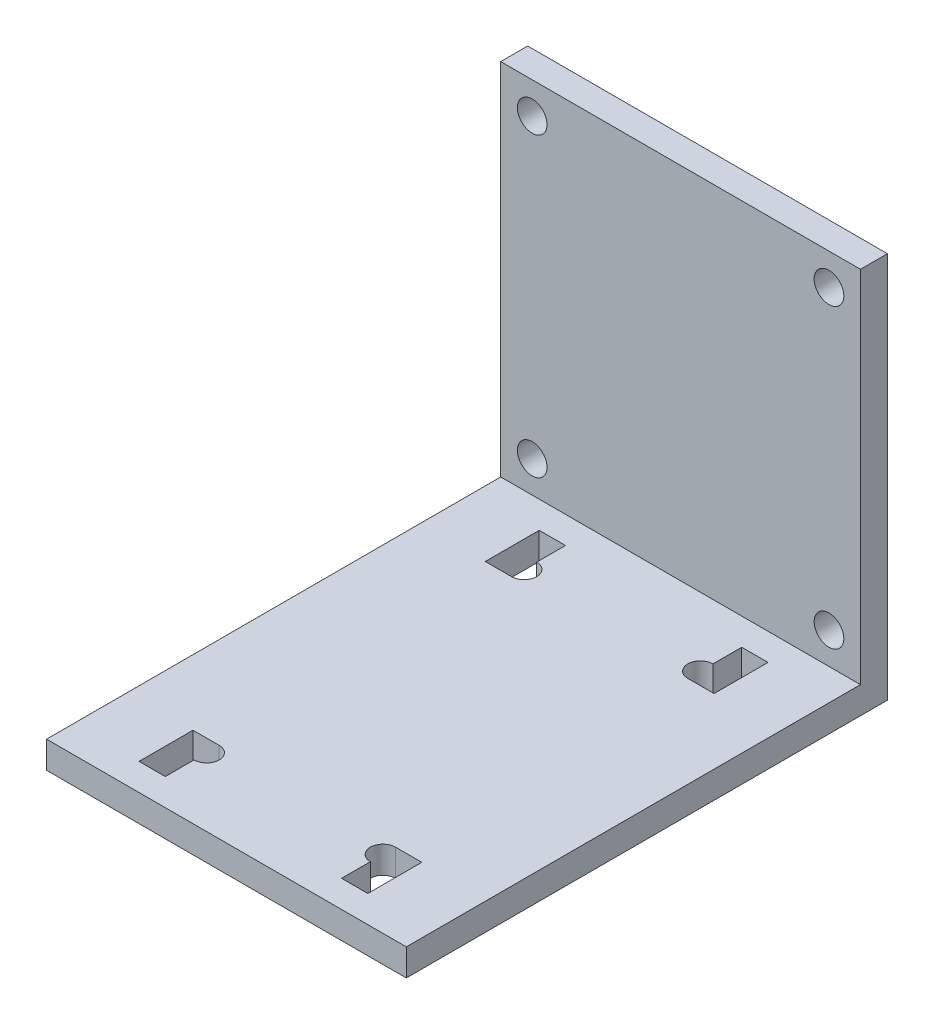
ISO-10303-21;
HEADER;
FILE_DESCRIPTION(('STEP AP214'),'2;1');
FILE_NAME('part.step','',(''),(''),'','','');
FILE_SCHEMA(('AUTOMOTIVE_DESIGN { 1 0 10303 214 1 1 1 1 }'));
ENDSEC;
DATA;
#1=APPLICATION_CONTEXT('core data for automotive mechanical design processes');
#2=APPLICATION_PROTOCOL_DEFINITION('international standard','automotive_design',2000,#1);
#3=PRODUCT_CONTEXT('',#1,'mechanical');
#4=PRODUCT('Part','Part','',(#3));
#5=PRODUCT_RELATED_PRODUCT_CATEGORY('part','',(#4));
#6=PRODUCT_DEFINITION_FORMATION('','',#4);
#7=PRODUCT_DEFINITION_CONTEXT('part definition',#1,'design');
#8=PRODUCT_DEFINITION('design','',#6,#7);
#9=PRODUCT_DEFINITION_SHAPE('','',#8);
#10=(LENGTH_UNIT() NAMED_UNIT(*) SI_UNIT(.MILLI.,.METRE.));
#11=(NAMED_UNIT(*) PLANE_ANGLE_UNIT() SI_UNIT($,.RADIAN.));
#12=(NAMED_UNIT(*) SI_UNIT($,.STERADIAN.) SOLID_ANGLE_UNIT());
#13=UNCERTAINTY_MEASURE_WITH_UNIT(LENGTH_MEASURE(1.E-05),#10,'distance_accuracy_value','');
#14=(GEOMETRIC_REPRESENTATION_CONTEXT(3) GLOBAL_UNCERTAINTY_ASSIGNED_CONTEXT((#13)) GLOBAL_UNIT_ASSIGNED_CONTEXT((#10,
#11,#12)) REPRESENTATION_CONTEXT('',''));
#15=CARTESIAN_POINT('',(0.,0.,0.));
#16=DIRECTION('',(0.,0.,1.));
#17=DIRECTION('',(1.,0.,0.));
#18=AXIS2_PLACEMENT_3D('',#15,#16,#17);
#19=CARTESIAN_POINT('',(0.,0.,3.));
#20=DIRECTION('',(0.,0.,-1.));
#21=DIRECTION('',(-1.,0.,0.));
#22=AXIS2_PLACEMENT_3D('',#19,#20,#21);
#23=PLANE('',#22);
#24=CARTESIAN_POINT('',(3.5,36.5,3.));
#25=DIRECTION('',(0.,0.,1.));
#26=DIRECTION('',(1.,0.,0.));
#27=AXIS2_PLACEMENT_3D('',#24,#25,#26);
#28=CIRCLE('',#27,1.65);
#29=CARTESIAN_POINT('',(5.15,36.5,3.));
#30=VERTEX_POINT('',#29);
#31=EDGE_CURVE('E106',#30,#30,#28,.T.);
#32=ORIENTED_EDGE('',*,*,#31,.F.);
#33=EDGE_LOOP('',(#32));
#34=FACE_BOUND('',#33,.T.);
#35=CARTESIAN_POINT('',(36.4999999999998,36.5,3.));
#36=DIRECTION('',(0.,0.,1.));
#37=DIRECTION('',(-1.,0.,0.));
#38=AXIS2_PLACEMENT_3D('',#35,#36,#37);
#39=CIRCLE('',#38,1.65);
#40=CARTESIAN_POINT('',(34.8499999999998,36.5,3.));
#41=VERTEX_POINT('',#40);
#42=EDGE_CURVE('E137',#41,#41,#39,.T.);
#43=ORIENTED_EDGE('',*,*,#42,.F.);
#44=EDGE_LOOP('',(#43));
#45=FACE_BOUND('',#44,.T.);
#46=CARTESIAN_POINT('',(36.4999999999998,3.5,3.));
#47=DIRECTION('',(0.,0.,1.));
#48=DIRECTION('',(1.,0.,0.));
#49=AXIS2_PLACEMENT_3D('',#46,#47,#48);
#50=CIRCLE('',#49,1.65);
#51=CARTESIAN_POINT('',(38.1499999999998,3.5,3.));
#52=VERTEX_POINT('',#51);
#53=EDGE_CURVE('E129',#52,#52,#50,.T.);
#54=ORIENTED_EDGE('',*,*,#53,.F.);
#55=EDGE_LOOP('',(#54));
#56=FACE_BOUND('',#55,.T.);
#57=CARTESIAN_POINT('',(3.5,3.5,3.));
#58=DIRECTION('',(0.,0.,1.));
#59=DIRECTION('',(-1.,0.,0.));
#60=AXIS2_PLACEMENT_3D('',#57,#58,#59);
#61=CIRCLE('',#60,1.65);
#62=CARTESIAN_POINT('',(1.85,3.5,3.));
#63=VERTEX_POINT('',#62);
#64=EDGE_CURVE('E120',#63,#63,#61,.T.);
#65=ORIENTED_EDGE('',*,*,#64,.F.);
#66=EDGE_LOOP('',(#65));
#67=FACE_BOUND('',#66,.T.);
#68=DIRECTION('',(-1.,0.,0.));
#69=VECTOR('',#68,1.);
#70=CARTESIAN_POINT('',(0.,0.,3.));
#71=LINE('',#70,#69);
#72=CARTESIAN_POINT('',(40.,0.,3.));
#73=VERTEX_POINT('',#72);
#74=CARTESIAN_POINT('',(0.,0.,3.));
#75=VERTEX_POINT('',#74);
#76=EDGE_CURVE('E57',#73,#75,#71,.T.);
#77=ORIENTED_EDGE('',*,*,#76,.F.);
#78=DIRECTION('',(0.,1.,0.));
#79=VECTOR('',#78,1.);
#80=CARTESIAN_POINT('',(40.,0.,3.));
#81=LINE('',#80,#79);
#82=CARTESIAN_POINT('',(40.,40.,3.));
#83=VERTEX_POINT('',#82);
#84=EDGE_CURVE('E111',#73,#83,#81,.T.);
#85=ORIENTED_EDGE('',*,*,#84,.T.);
#86=DIRECTION('',(-1.,0.,0.));
#87=VECTOR('',#86,1.);
#88=CARTESIAN_POINT('',(0.,40.,3.));
#89=LINE('',#88,#87);
#90=CARTESIAN_POINT('',(0.,40.,3.));
#91=VERTEX_POINT('',#90);
#92=EDGE_CURVE('E63',#83,#91,#89,.T.);
#93=ORIENTED_EDGE('',*,*,#92,.T.);
#94=DIRECTION('',(0.,-1.,0.));
#95=VECTOR('',#94,1.);
#96=CARTESIAN_POINT('',(0.,0.,3.));
#97=LINE('',#96,#95);
#98=EDGE_CURVE('E84',#91,#75,#97,.T.);
#99=ORIENTED_EDGE('',*,*,#98,.T.);
#100=EDGE_LOOP('',(#77,#85,#93,#99));
#101=FACE_BOUND('',#100,.T.);
#102=ADVANCED_FACE('F41',(#34,#45,#56,#67,#101),#23,.F.);
#103=CARTESIAN_POINT('',(0.,0.,3.));
#104=DIRECTION('',(1.,0.,0.));
#105=DIRECTION('',(0.,0.,-1.));
#106=AXIS2_PLACEMENT_3D('',#103,#104,#105);
#107=PLANE('',#106);
#108=DIRECTION('',(0.,-1.,0.));
#109=VECTOR('',#108,1.);
#110=CARTESIAN_POINT('',(0.,0.,0.));
#111=LINE('',#110,#109);
#112=CARTESIAN_POINT('',(0.,40.,0.));
#113=VERTEX_POINT('',#112);
#114=CARTESIAN_POINT('',(0.,-3.,0.));
#115=VERTEX_POINT('',#114);
#116=EDGE_CURVE('E91',#113,#115,#111,.T.);
#117=ORIENTED_EDGE('',*,*,#116,.T.);
#118=DIRECTION('',(0.,0.,1.));
#119=VECTOR('',#118,1.);
#120=CARTESIAN_POINT('',(0.,-3.,0.));
#121=LINE('',#120,#119);
#122=CARTESIAN_POINT('',(0.,-3.,53.5));
#123=VERTEX_POINT('',#122);
#124=EDGE_CURVE('E144',#115,#123,#121,.T.);
#125=ORIENTED_EDGE('',*,*,#124,.T.);
#126=DIRECTION('',(0.,-1.,0.));
#127=VECTOR('',#126,1.);
#128=CARTESIAN_POINT('',(0.,0.,53.5));
#129=LINE('',#128,#127);
#130=CARTESIAN_POINT('',(0.,0.,53.5));
#131=VERTEX_POINT('',#130);
#132=EDGE_CURVE('E198',#131,#123,#129,.T.);
#133=ORIENTED_EDGE('',*,*,#132,.F.);
#134=DIRECTION('',(0.,0.,1.));
#135=VECTOR('',#134,1.);
#136=CARTESIAN_POINT('',(0.,0.,0.));
#137=LINE('',#136,#135);
#138=EDGE_CURVE('E365',#75,#131,#137,.T.);
#139=ORIENTED_EDGE('',*,*,#138,.F.);
#140=ORIENTED_EDGE('',*,*,#98,.F.);
#141=DIRECTION('',(0.,0.,-1.));
#142=VECTOR('',#141,1.);
#143=CARTESIAN_POINT('',(0.,40.,3.));
#144=LINE('',#143,#142);
#145=EDGE_CURVE('E50',#91,#113,#144,.T.);
#146=ORIENTED_EDGE('',*,*,#145,.T.);
#147=EDGE_LOOP('',(#117,#125,#133,#139,#140,#146));
#148=FACE_BOUND('',#147,.T.);
#149=ADVANCED_FACE('F43',(#148),#107,.F.);
#150=CARTESIAN_POINT('',(40.,0.,3.));
#151=DIRECTION('',(-1.,0.,0.));
#152=DIRECTION('',(0.,0.,1.));
#153=AXIS2_PLACEMENT_3D('',#150,#151,#152);
#154=PLANE('',#153);
#155=DIRECTION('',(0.,1.,0.));
#156=VECTOR('',#155,1.);
#157=CARTESIAN_POINT('',(40.,0.,0.));
#158=LINE('',#157,#156);
#159=CARTESIAN_POINT('',(40.,-3.,0.));
#160=VERTEX_POINT('',#159);
#161=CARTESIAN_POINT('',(40.,40.,0.));
#162=VERTEX_POINT('',#161);
#163=EDGE_CURVE('E85',#160,#162,#158,.T.);
#164=ORIENTED_EDGE('',*,*,#163,.T.);
#165=DIRECTION('',(0.,0.,-1.));
#166=VECTOR('',#165,1.);
#167=CARTESIAN_POINT('',(40.,40.,3.));
#168=LINE('',#167,#166);
#169=EDGE_CURVE('E11',#83,#162,#168,.T.);
#170=ORIENTED_EDGE('',*,*,#169,.F.);
#171=ORIENTED_EDGE('',*,*,#84,.F.);
#172=DIRECTION('',(0.,0.,1.));
#173=VECTOR('',#172,1.);
#174=CARTESIAN_POINT('',(40.,0.,0.));
#175=LINE('',#174,#173);
#176=CARTESIAN_POINT('',(40.,0.,53.5));
#177=VERTEX_POINT('',#176);
#178=EDGE_CURVE('E373',#73,#177,#175,.T.);
#179=ORIENTED_EDGE('',*,*,#178,.T.);
#180=DIRECTION('',(0.,-1.,0.));
#181=VECTOR('',#180,1.);
#182=CARTESIAN_POINT('',(40.,0.,53.5));
#183=LINE('',#182,#181);
#184=CARTESIAN_POINT('',(40.,-3.,53.5));
#185=VERTEX_POINT('',#184);
#186=EDGE_CURVE('E194',#177,#185,#183,.T.);
#187=ORIENTED_EDGE('',*,*,#186,.T.);
#188=DIRECTION('',(0.,0.,1.));
#189=VECTOR('',#188,1.);
#190=CARTESIAN_POINT('',(40.,-3.,0.));
#191=LINE('',#190,#189);
#192=EDGE_CURVE('E125',#160,#185,#191,.T.);
#193=ORIENTED_EDGE('',*,*,#192,.F.);
#194=EDGE_LOOP('',(#164,#170,#171,#179,#187,#193));
#195=FACE_BOUND('',#194,.T.);
#196=ADVANCED_FACE('F544',(#195),#154,.F.);
#197=CARTESIAN_POINT('',(0.,40.,3.));
#198=DIRECTION('',(0.,-1.,0.));
#199=DIRECTION('',(0.,0.,-1.));
#200=AXIS2_PLACEMENT_3D('',#197,#198,#199);
#201=PLANE('',#200);
#202=DIRECTION('',(-1.,0.,0.));
#203=VECTOR('',#202,1.);
#204=CARTESIAN_POINT('',(0.,40.,0.));
#205=LINE('',#204,#203);
#206=EDGE_CURVE('E75',#162,#113,#205,.T.);
#207=ORIENTED_EDGE('',*,*,#206,.T.);
#208=ORIENTED_EDGE('',*,*,#145,.F.);
#209=ORIENTED_EDGE('',*,*,#92,.F.);
#210=ORIENTED_EDGE('',*,*,#169,.T.);
#211=EDGE_LOOP('',(#207,#208,#209,#210));
#212=FACE_BOUND('',#211,.T.);
#213=ADVANCED_FACE('F77',(#212),#201,.F.);
#214=CARTESIAN_POINT('',(0.,0.,0.));
#215=DIRECTION('',(0.,0.,-1.));
#216=DIRECTION('',(-1.,0.,0.));
#217=AXIS2_PLACEMENT_3D('',#214,#215,#216);
#218=PLANE('',#217);
#219=CARTESIAN_POINT('',(3.5,3.5,0.));
#220=DIRECTION('',(0.,0.,1.));
#221=DIRECTION('',(-1.,0.,0.));
#222=AXIS2_PLACEMENT_3D('',#219,#220,#221);
#223=CIRCLE('',#222,1.65);
#224=CARTESIAN_POINT('',(1.85,3.5,0.));
#225=VERTEX_POINT('',#224);
#226=EDGE_CURVE('E124',#225,#225,#223,.T.);
#227=ORIENTED_EDGE('',*,*,#226,.T.);
#228=EDGE_LOOP('',(#227));
#229=FACE_BOUND('',#228,.T.);
#230=CARTESIAN_POINT('',(36.4999999999998,3.5,0.));
#231=DIRECTION('',(0.,0.,1.));
#232=DIRECTION('',(1.,0.,0.));
#233=AXIS2_PLACEMENT_3D('',#230,#231,#232);
#234=CIRCLE('',#233,1.65);
#235=CARTESIAN_POINT('',(38.1499999999998,3.5,0.));
#236=VERTEX_POINT('',#235);
#237=EDGE_CURVE('E133',#236,#236,#234,.T.);
#238=ORIENTED_EDGE('',*,*,#237,.T.);
#239=EDGE_LOOP('',(#238));
#240=FACE_BOUND('',#239,.T.);
#241=CARTESIAN_POINT('',(36.4999999999998,36.5,0.));
#242=DIRECTION('',(0.,0.,1.));
#243=DIRECTION('',(-1.,0.,0.));
#244=AXIS2_PLACEMENT_3D('',#241,#242,#243);
#245=CIRCLE('',#244,1.65);
#246=CARTESIAN_POINT('',(34.8499999999998,36.5,0.));
#247=VERTEX_POINT('',#246);
#248=EDGE_CURVE('E118',#247,#247,#245,.T.);
#249=ORIENTED_EDGE('',*,*,#248,.T.);
#250=EDGE_LOOP('',(#249));
#251=FACE_BOUND('',#250,.T.);
#252=CARTESIAN_POINT('',(3.5,36.5,0.));
#253=DIRECTION('',(0.,0.,1.));
#254=DIRECTION('',(1.,0.,0.));
#255=AXIS2_PLACEMENT_3D('',#252,#253,#254);
#256=CIRCLE('',#255,1.65);
#257=CARTESIAN_POINT('',(5.15,36.5,0.));
#258=VERTEX_POINT('',#257);
#259=EDGE_CURVE('E100',#258,#258,#256,.T.);
#260=ORIENTED_EDGE('',*,*,#259,.T.);
#261=EDGE_LOOP('',(#260));
#262=FACE_BOUND('',#261,.T.);
#263=ORIENTED_EDGE('',*,*,#116,.F.);
#264=ORIENTED_EDGE('',*,*,#206,.F.);
#265=ORIENTED_EDGE('',*,*,#163,.F.);
#266=DIRECTION('',(1.,0.,0.));
#267=VECTOR('',#266,1.);
#268=CARTESIAN_POINT('',(0.,-3.,0.));
#269=LINE('',#268,#267);
#270=EDGE_CURVE('E98',#115,#160,#269,.T.);
#271=ORIENTED_EDGE('',*,*,#270,.F.);
#272=EDGE_LOOP('',(#263,#264,#265,#271));
#273=FACE_BOUND('',#272,.T.);
#274=ADVANCED_FACE('F96',(#229,#240,#251,#262,#273),#218,.T.);
#275=CARTESIAN_POINT('',(3.5,36.5,0.));
#276=DIRECTION('',(0.,0.,1.));
#277=DIRECTION('',(1.,0.,0.));
#278=AXIS2_PLACEMENT_3D('',#275,#276,#277);
#279=CYLINDRICAL_SURFACE('',#278,1.65);
#280=ORIENTED_EDGE('',*,*,#259,.F.);
#281=EDGE_LOOP('',(#280));
#282=FACE_BOUND('',#281,.T.);
#283=ORIENTED_EDGE('',*,*,#31,.T.);
#284=EDGE_LOOP('',(#283));
#285=FACE_BOUND('',#284,.T.);
#286=ADVANCED_FACE('F567',(#282,#285),#279,.F.);
#287=CARTESIAN_POINT('',(36.4999999999998,36.5,0.));
#288=DIRECTION('',(0.,0.,1.));
#289=DIRECTION('',(1.,0.,0.));
#290=AXIS2_PLACEMENT_3D('',#287,#288,#289);
#291=CYLINDRICAL_SURFACE('',#290,1.65);
#292=ORIENTED_EDGE('',*,*,#248,.F.);
#293=EDGE_LOOP('',(#292));
#294=FACE_BOUND('',#293,.T.);
#295=ORIENTED_EDGE('',*,*,#42,.T.);
#296=EDGE_LOOP('',(#295));
#297=FACE_BOUND('',#296,.T.);
#298=ADVANCED_FACE('F594',(#294,#297),#291,.F.);
#299=CARTESIAN_POINT('',(36.4999999999998,3.5,0.));
#300=DIRECTION('',(0.,0.,1.));
#301=DIRECTION('',(1.,0.,0.));
#302=AXIS2_PLACEMENT_3D('',#299,#300,#301);
#303=CYLINDRICAL_SURFACE('',#302,1.65);
#304=ORIENTED_EDGE('',*,*,#237,.F.);
#305=EDGE_LOOP('',(#304));
#306=FACE_BOUND('',#305,.T.);
#307=ORIENTED_EDGE('',*,*,#53,.T.);
#308=EDGE_LOOP('',(#307));
#309=FACE_BOUND('',#308,.T.);
#310=ADVANCED_FACE('F601',(#306,#309),#303,.F.);
#311=CARTESIAN_POINT('',(3.5,3.5,0.));
#312=DIRECTION('',(0.,0.,1.));
#313=DIRECTION('',(1.,0.,0.));
#314=AXIS2_PLACEMENT_3D('',#311,#312,#313);
#315=CYLINDRICAL_SURFACE('',#314,1.65);
#316=ORIENTED_EDGE('',*,*,#226,.F.);
#317=EDGE_LOOP('',(#316));
#318=FACE_BOUND('',#317,.T.);
#319=ORIENTED_EDGE('',*,*,#64,.T.);
#320=EDGE_LOOP('',(#319));
#321=FACE_BOUND('',#320,.T.);
#322=ADVANCED_FACE('F609',(#318,#321),#315,.F.);
#323=CARTESIAN_POINT('',(0.,-3.,0.));
#324=DIRECTION('',(0.,-1.,0.));
#325=DIRECTION('',(0.,0.,-1.));
#326=AXIS2_PLACEMENT_3D('',#323,#324,#325);
#327=PLANE('',#326);
#328=ORIENTED_EDGE('',*,*,#192,.T.);
#329=DIRECTION('',(1.,0.,0.));
#330=VECTOR('',#329,1.);
#331=CARTESIAN_POINT('',(0.,-3.,53.5));
#332=LINE('',#331,#330);
#333=EDGE_CURVE('E282',#123,#185,#332,.T.);
#334=ORIENTED_EDGE('',*,*,#333,.F.);
#335=ORIENTED_EDGE('',*,*,#124,.F.);
#336=ORIENTED_EDGE('',*,*,#270,.T.);
#337=EDGE_LOOP('',(#328,#334,#335,#336));
#338=FACE_BOUND('',#337,.T.);
#339=CARTESIAN_POINT('',(29.8,-3.,10.6));
#340=DIRECTION('',(0.,-1.,0.));
#341=DIRECTION('',(0.,0.,-1.));
#342=AXIS2_PLACEMENT_3D('',#339,#340,#341);
#343=CIRCLE('',#342,1.4);
#344=CARTESIAN_POINT('',(29.8,-3.,12.));
#345=VERTEX_POINT('',#344);
#346=CARTESIAN_POINT('',(29.8,-3.,9.2));
#347=VERTEX_POINT('',#346);
#348=EDGE_CURVE('E322',#345,#347,#343,.T.);
#349=ORIENTED_EDGE('',*,*,#348,.F.);
#350=DIRECTION('',(-1.,0.,0.));
#351=VECTOR('',#350,1.);
#352=CARTESIAN_POINT('',(0.,-3.,12.));
#353=LINE('',#352,#351);
#354=CARTESIAN_POINT('',(32.72,-3.,12.));
#355=VERTEX_POINT('',#354);
#356=EDGE_CURVE('E318',#355,#345,#353,.T.);
#357=ORIENTED_EDGE('',*,*,#356,.F.);
#358=DIRECTION('',(0.,0.,1.));
#359=VECTOR('',#358,1.);
#360=CARTESIAN_POINT('',(32.72,-3.,0.));
#361=LINE('',#360,#359);
#362=CARTESIAN_POINT('',(32.72,-3.,6.));
#363=VERTEX_POINT('',#362);
#364=EDGE_CURVE('E314',#363,#355,#361,.T.);
#365=ORIENTED_EDGE('',*,*,#364,.F.);
#366=DIRECTION('',(-1.,0.,0.));
#367=VECTOR('',#366,1.);
#368=CARTESIAN_POINT('',(0.,-3.,5.99999999999999));
#369=LINE('',#368,#367);
#370=CARTESIAN_POINT('',(29.8,-3.,6.));
#371=VERTEX_POINT('',#370);
#372=EDGE_CURVE('E310',#363,#371,#369,.T.);
#373=ORIENTED_EDGE('',*,*,#372,.T.);
#374=DIRECTION('',(0.,0.,1.));
#375=VECTOR('',#374,1.);
#376=CARTESIAN_POINT('',(29.8,-3.,-1.6154612370034E-13));
#377=LINE('',#376,#375);
#378=EDGE_CURVE('E306',#371,#347,#377,.T.);
#379=ORIENTED_EDGE('',*,*,#378,.T.);
#380=EDGE_LOOP('',(#349,#357,#365,#373,#379));
#381=FACE_BOUND('',#380,.T.);
#382=CARTESIAN_POINT('',(10.2,-3.,45.9));
#383=DIRECTION('',(0.,-1.,0.));
#384=DIRECTION('',(0.,0.,-1.));
#385=AXIS2_PLACEMENT_3D('',#382,#383,#384);
#386=CIRCLE('',#385,1.4);
#387=CARTESIAN_POINT('',(10.2,-3.,44.5));
#388=VERTEX_POINT('',#387);
#389=CARTESIAN_POINT('',(10.2,-3.,47.3));
#390=VERTEX_POINT('',#389);
#391=EDGE_CURVE('E302',#388,#390,#386,.T.);
#392=ORIENTED_EDGE('',*,*,#391,.F.);
#393=DIRECTION('',(1.,0.,0.));
#394=VECTOR('',#393,1.);
#395=CARTESIAN_POINT('',(0.,-3.,44.5));
#396=LINE('',#395,#394);
#397=CARTESIAN_POINT('',(7.28,-3.,44.5));
#398=VERTEX_POINT('',#397);
#399=EDGE_CURVE('E298',#398,#388,#396,.T.);
#400=ORIENTED_EDGE('',*,*,#399,.F.);
#401=DIRECTION('',(0.,0.,-1.));
#402=VECTOR('',#401,1.);
#403=CARTESIAN_POINT('',(7.28000000000001,-3.,0.));
#404=LINE('',#403,#402);
#405=CARTESIAN_POINT('',(7.27999999999999,-3.,50.5));
#406=VERTEX_POINT('',#405);
#407=EDGE_CURVE('E294',#406,#398,#404,.T.);
#408=ORIENTED_EDGE('',*,*,#407,.F.);
#409=DIRECTION('',(1.,0.,0.));
#410=VECTOR('',#409,1.);
#411=CARTESIAN_POINT('',(0.,-3.,50.5));
#412=LINE('',#411,#410);
#413=CARTESIAN_POINT('',(10.2,-3.,50.5));
#414=VERTEX_POINT('',#413);
#415=EDGE_CURVE('E290',#406,#414,#412,.T.);
#416=ORIENTED_EDGE('',*,*,#415,.T.);
#417=DIRECTION('',(0.,0.,-1.));
#418=VECTOR('',#417,1.);
#419=CARTESIAN_POINT('',(10.1999999999997,-3.,0.));
#420=LINE('',#419,#418);
#421=EDGE_CURVE('E286',#414,#390,#420,.T.);
#422=ORIENTED_EDGE('',*,*,#421,.T.);
#423=EDGE_LOOP('',(#392,#400,#408,#416,#422));
#424=FACE_BOUND('',#423,.T.);
#425=DIRECTION('',(-1.,0.,0.));
#426=VECTOR('',#425,1.);
#427=CARTESIAN_POINT('',(0.,-3.,44.5));
#428=LINE('',#427,#426);
#429=CARTESIAN_POINT('',(32.72,-3.,44.5));
#430=VERTEX_POINT('',#429);
#431=CARTESIAN_POINT('',(29.8,-3.,44.5));
#432=VERTEX_POINT('',#431);
#433=EDGE_CURVE('E278',#430,#432,#428,.T.);
#434=ORIENTED_EDGE('',*,*,#433,.T.);
#435=CARTESIAN_POINT('',(29.8,-3.,45.9));
#436=DIRECTION('',(0.,-1.,0.));
#437=DIRECTION('',(0.,0.,-1.));
#438=AXIS2_PLACEMENT_3D('',#435,#436,#437);
#439=CIRCLE('',#438,1.4);
#440=CARTESIAN_POINT('',(29.8,-3.,47.3));
#441=VERTEX_POINT('',#440);
#442=EDGE_CURVE('E274',#432,#441,#439,.F.);
#443=ORIENTED_EDGE('',*,*,#442,.T.);
#444=DIRECTION('',(0.,0.,-1.));
#445=VECTOR('',#444,1.);
#446=CARTESIAN_POINT('',(29.8000000000003,-3.,1.61546123700342E-13));
#447=LINE('',#446,#445);
#448=CARTESIAN_POINT('',(29.8,-3.,50.5));
#449=VERTEX_POINT('',#448);
#450=EDGE_CURVE('E270',#449,#441,#447,.T.);
#451=ORIENTED_EDGE('',*,*,#450,.F.);
#452=DIRECTION('',(-1.,0.,0.));
#453=VECTOR('',#452,1.);
#454=CARTESIAN_POINT('',(0.,-3.,50.5));
#455=LINE('',#454,#453);
#456=CARTESIAN_POINT('',(32.72,-3.,50.5));
#457=VERTEX_POINT('',#456);
#458=EDGE_CURVE('E266',#457,#449,#455,.T.);
#459=ORIENTED_EDGE('',*,*,#458,.F.);
#460=DIRECTION('',(0.,0.,-1.));
#461=VECTOR('',#460,1.);
#462=CARTESIAN_POINT('',(32.72,-3.,0.));
#463=LINE('',#462,#461);
#464=EDGE_CURVE('E262',#457,#430,#463,.T.);
#465=ORIENTED_EDGE('',*,*,#464,.T.);
#466=EDGE_LOOP('',(#434,#443,#451,#459,#465));
#467=FACE_BOUND('',#466,.T.);
#468=DIRECTION('',(1.,0.,0.));
#469=VECTOR('',#468,1.);
#470=CARTESIAN_POINT('',(0.,-3.,12.));
#471=LINE('',#470,#469);
#472=CARTESIAN_POINT('',(7.27999999999999,-3.,12.));
#473=VERTEX_POINT('',#472);
#474=CARTESIAN_POINT('',(10.2,-3.,12.));
#475=VERTEX_POINT('',#474);
#476=EDGE_CURVE('E258',#473,#475,#471,.T.);
#477=ORIENTED_EDGE('',*,*,#476,.T.);
#478=CARTESIAN_POINT('',(10.2,-3.,10.6));
#479=DIRECTION('',(0.,-1.,0.));
#480=DIRECTION('',(0.,0.,-1.));
#481=AXIS2_PLACEMENT_3D('',#478,#479,#480);
#482=CIRCLE('',#481,1.4);
#483=CARTESIAN_POINT('',(10.2,-3.,9.2));
#484=VERTEX_POINT('',#483);
#485=EDGE_CURVE('E254',#475,#484,#482,.F.);
#486=ORIENTED_EDGE('',*,*,#485,.T.);
#487=DIRECTION('',(0.,0.,1.));
#488=VECTOR('',#487,1.);
#489=CARTESIAN_POINT('',(10.2,-3.,0.));
#490=LINE('',#489,#488);
#491=CARTESIAN_POINT('',(10.2,-3.,6.));
#492=VERTEX_POINT('',#491);
#493=EDGE_CURVE('E250',#492,#484,#490,.T.);
#494=ORIENTED_EDGE('',*,*,#493,.F.);
#495=DIRECTION('',(1.,0.,0.));
#496=VECTOR('',#495,1.);
#497=CARTESIAN_POINT('',(0.,-3.,6.));
#498=LINE('',#497,#496);
#499=CARTESIAN_POINT('',(7.27999999999999,-3.,6.));
#500=VERTEX_POINT('',#499);
#501=EDGE_CURVE('E246',#500,#492,#498,.T.);
#502=ORIENTED_EDGE('',*,*,#501,.F.);
#503=DIRECTION('',(0.,0.,1.));
#504=VECTOR('',#503,1.);
#505=CARTESIAN_POINT('',(7.27999999999999,-3.,0.));
#506=LINE('',#505,#504);
#507=EDGE_CURVE('E241',#500,#473,#506,.T.);
#508=ORIENTED_EDGE('',*,*,#507,.T.);
#509=EDGE_LOOP('',(#477,#486,#494,#502,#508));
#510=FACE_BOUND('',#509,.T.);
#511=ADVANCED_FACE('F548',(#338,#381,#424,#467,#510),#327,.T.);
#512=CARTESIAN_POINT('',(0.,0.,12.));
#513=DIRECTION('',(0.,0.,-1.));
#514=DIRECTION('',(-1.,0.,0.));
#515=AXIS2_PLACEMENT_3D('',#512,#513,#514);
#516=PLANE('',#515);
#517=ORIENTED_EDGE('',*,*,#476,.F.);
#518=DIRECTION('',(0.,-1.,0.));
#519=VECTOR('',#518,1.);
#520=CARTESIAN_POINT('',(7.27999999999999,0.,12.));
#521=LINE('',#520,#519);
#522=CARTESIAN_POINT('',(7.27999999999999,0.,12.));
#523=VERTEX_POINT('',#522);
#524=EDGE_CURVE('E152',#523,#473,#521,.T.);
#525=ORIENTED_EDGE('',*,*,#524,.F.);
#526=DIRECTION('',(1.,0.,0.));
#527=VECTOR('',#526,1.);
#528=CARTESIAN_POINT('',(0.,0.,12.));
#529=LINE('',#528,#527);
#530=CARTESIAN_POINT('',(10.2,0.,12.));
#531=VERTEX_POINT('',#530);
#532=EDGE_CURVE('E341',#523,#531,#529,.T.);
#533=ORIENTED_EDGE('',*,*,#532,.T.);
#534=DIRECTION('',(0.,-1.,0.));
#535=VECTOR('',#534,1.);
#536=CARTESIAN_POINT('',(10.2,0.,12.));
#537=LINE('',#536,#535);
#538=EDGE_CURVE('E222',#531,#475,#537,.T.);
#539=ORIENTED_EDGE('',*,*,#538,.T.);
#540=EDGE_LOOP('',(#517,#525,#533,#539));
#541=FACE_BOUND('',#540,.T.);
#542=ADVANCED_FACE('F621',(#541),#516,.T.);
#543=CARTESIAN_POINT('',(7.27999999999999,0.,0.));
#544=DIRECTION('',(1.,0.,0.));
#545=DIRECTION('',(0.,0.,-1.));
#546=AXIS2_PLACEMENT_3D('',#543,#544,#545);
#547=PLANE('',#546);
#548=ORIENTED_EDGE('',*,*,#507,.F.);
#549=DIRECTION('',(0.,-1.,0.));
#550=VECTOR('',#549,1.);
#551=CARTESIAN_POINT('',(7.27999999999999,0.,6.));
#552=LINE('',#551,#550);
#553=CARTESIAN_POINT('',(7.27999999999999,0.,6.));
#554=VERTEX_POINT('',#553);
#555=EDGE_CURVE('E234',#554,#500,#552,.T.);
#556=ORIENTED_EDGE('',*,*,#555,.F.);
#557=DIRECTION('',(0.,0.,1.));
#558=VECTOR('',#557,1.);
#559=CARTESIAN_POINT('',(7.27999999999999,0.,0.));
#560=LINE('',#559,#558);
#561=EDGE_CURVE('E158',#554,#523,#560,.T.);
#562=ORIENTED_EDGE('',*,*,#561,.T.);
#563=ORIENTED_EDGE('',*,*,#524,.T.);
#564=EDGE_LOOP('',(#548,#556,#562,#563));
#565=FACE_BOUND('',#564,.T.);
#566=ADVANCED_FACE('F628',(#565),#547,.T.);
#567=CARTESIAN_POINT('',(0.,0.,6.));
#568=DIRECTION('',(0.,0.,-1.));
#569=DIRECTION('',(-1.,0.,0.));
#570=AXIS2_PLACEMENT_3D('',#567,#568,#569);
#571=PLANE('',#570);
#572=ORIENTED_EDGE('',*,*,#501,.T.);
#573=DIRECTION('',(0.,-1.,0.));
#574=VECTOR('',#573,1.);
#575=CARTESIAN_POINT('',(10.2,0.,6.));
#576=LINE('',#575,#574);
#577=CARTESIAN_POINT('',(10.2,0.,6.));
#578=VERTEX_POINT('',#577);
#579=EDGE_CURVE('E230',#578,#492,#576,.T.);
#580=ORIENTED_EDGE('',*,*,#579,.F.);
#581=DIRECTION('',(1.,0.,0.));
#582=VECTOR('',#581,1.);
#583=CARTESIAN_POINT('',(0.,0.,6.));
#584=LINE('',#583,#582);
#585=EDGE_CURVE('E329',#554,#578,#584,.T.);
#586=ORIENTED_EDGE('',*,*,#585,.F.);
#587=ORIENTED_EDGE('',*,*,#555,.T.);
#588=EDGE_LOOP('',(#572,#580,#586,#587));
#589=FACE_BOUND('',#588,.T.);
#590=ADVANCED_FACE('F636',(#589),#571,.F.);
#591=CARTESIAN_POINT('',(10.2,0.,0.));
#592=DIRECTION('',(1.,0.,0.));
#593=DIRECTION('',(0.,0.,-1.));
#594=AXIS2_PLACEMENT_3D('',#591,#592,#593);
#595=PLANE('',#594);
#596=ORIENTED_EDGE('',*,*,#493,.T.);
#597=DIRECTION('',(0.,-1.,0.));
#598=VECTOR('',#597,1.);
#599=CARTESIAN_POINT('',(10.2,0.,9.2));
#600=LINE('',#599,#598);
#601=CARTESIAN_POINT('',(10.2,0.,9.2));
#602=VERTEX_POINT('',#601);
#603=EDGE_CURVE('E226',#602,#484,#600,.T.);
#604=ORIENTED_EDGE('',*,*,#603,.F.);
#605=DIRECTION('',(0.,0.,1.));
#606=VECTOR('',#605,1.);
#607=CARTESIAN_POINT('',(10.2,0.,0.));
#608=LINE('',#607,#606);
#609=EDGE_CURVE('E333',#578,#602,#608,.T.);
#610=ORIENTED_EDGE('',*,*,#609,.F.);
#611=ORIENTED_EDGE('',*,*,#579,.T.);
#612=EDGE_LOOP('',(#596,#604,#610,#611));
#613=FACE_BOUND('',#612,.T.);
#614=ADVANCED_FACE('F644',(#613),#595,.F.);
#615=CARTESIAN_POINT('',(0.,0.,44.5));
#616=DIRECTION('',(0.,0.,1.));
#617=DIRECTION('',(1.,0.,0.));
#618=AXIS2_PLACEMENT_3D('',#615,#616,#617);
#619=PLANE('',#618);
#620=ORIENTED_EDGE('',*,*,#433,.F.);
#621=DIRECTION('',(0.,-1.,0.));
#622=VECTOR('',#621,1.);
#623=CARTESIAN_POINT('',(32.72,0.,44.5));
#624=LINE('',#623,#622);
#625=CARTESIAN_POINT('',(32.72,0.,44.5));
#626=VERTEX_POINT('',#625);
#627=EDGE_CURVE('E218',#626,#430,#624,.T.);
#628=ORIENTED_EDGE('',*,*,#627,.F.);
#629=DIRECTION('',(-1.,0.,0.));
#630=VECTOR('',#629,1.);
#631=CARTESIAN_POINT('',(0.,0.,44.5));
#632=LINE('',#631,#630);
#633=CARTESIAN_POINT('',(29.8,0.,44.5));
#634=VERTEX_POINT('',#633);
#635=EDGE_CURVE('E361',#626,#634,#632,.T.);
#636=ORIENTED_EDGE('',*,*,#635,.T.);
#637=DIRECTION('',(0.,-1.,0.));
#638=VECTOR('',#637,1.);
#639=CARTESIAN_POINT('',(29.8,0.,44.5));
#640=LINE('',#639,#638);
#641=EDGE_CURVE('E202',#634,#432,#640,.T.);
#642=ORIENTED_EDGE('',*,*,#641,.T.);
#643=EDGE_LOOP('',(#620,#628,#636,#642));
#644=FACE_BOUND('',#643,.T.);
#645=ADVANCED_FACE('F652',(#644),#619,.T.);
#646=CARTESIAN_POINT('',(32.72,0.,0.));
#647=DIRECTION('',(-1.,0.,0.));
#648=DIRECTION('',(0.,0.,1.));
#649=AXIS2_PLACEMENT_3D('',#646,#647,#648);
#650=PLANE('',#649);
#651=ORIENTED_EDGE('',*,*,#464,.F.);
#652=DIRECTION('',(0.,-1.,0.));
#653=VECTOR('',#652,1.);
#654=CARTESIAN_POINT('',(32.72,0.,50.5));
#655=LINE('',#654,#653);
#656=CARTESIAN_POINT('',(32.72,0.,50.5));
#657=VERTEX_POINT('',#656);
#658=EDGE_CURVE('E214',#657,#457,#655,.T.);
#659=ORIENTED_EDGE('',*,*,#658,.F.);
#660=DIRECTION('',(0.,0.,-1.));
#661=VECTOR('',#660,1.);
#662=CARTESIAN_POINT('',(32.72,0.,0.));
#663=LINE('',#662,#661);
#664=EDGE_CURVE('E345',#657,#626,#663,.T.);
#665=ORIENTED_EDGE('',*,*,#664,.T.);
#666=ORIENTED_EDGE('',*,*,#627,.T.);
#667=EDGE_LOOP('',(#651,#659,#665,#666));
#668=FACE_BOUND('',#667,.T.);
#669=ADVANCED_FACE('F660',(#668),#650,.T.);
#670=CARTESIAN_POINT('',(0.,0.,50.5));
#671=DIRECTION('',(0.,0.,1.));
#672=DIRECTION('',(1.,0.,0.));
#673=AXIS2_PLACEMENT_3D('',#670,#671,#672);
#674=PLANE('',#673);
#675=ORIENTED_EDGE('',*,*,#458,.T.);
#676=DIRECTION('',(0.,-1.,0.));
#677=VECTOR('',#676,1.);
#678=CARTESIAN_POINT('',(29.8,0.,50.5));
#679=LINE('',#678,#677);
#680=CARTESIAN_POINT('',(29.8,0.,50.5));
#681=VERTEX_POINT('',#680);
#682=EDGE_CURVE('E210',#681,#449,#679,.T.);
#683=ORIENTED_EDGE('',*,*,#682,.F.);
#684=DIRECTION('',(-1.,0.,0.));
#685=VECTOR('',#684,1.);
#686=CARTESIAN_POINT('',(0.,0.,50.5));
#687=LINE('',#686,#685);
#688=EDGE_CURVE('E349',#657,#681,#687,.T.);
#689=ORIENTED_EDGE('',*,*,#688,.F.);
#690=ORIENTED_EDGE('',*,*,#658,.T.);
#691=EDGE_LOOP('',(#675,#683,#689,#690));
#692=FACE_BOUND('',#691,.T.);
#693=ADVANCED_FACE('F668',(#692),#674,.F.);
#694=CARTESIAN_POINT('',(29.8000000000003,0.,1.61546123700342E-13));
#695=DIRECTION('',(-1.,0.,0.));
#696=DIRECTION('',(0.,0.,1.));
#697=AXIS2_PLACEMENT_3D('',#694,#695,#696);
#698=PLANE('',#697);
#699=ORIENTED_EDGE('',*,*,#450,.T.);
#700=DIRECTION('',(0.,-1.,0.));
#701=VECTOR('',#700,1.);
#702=CARTESIAN_POINT('',(29.8,0.,47.3));
#703=LINE('',#702,#701);
#704=CARTESIAN_POINT('',(29.8,0.,47.3));
#705=VERTEX_POINT('',#704);
#706=EDGE_CURVE('E206',#705,#441,#703,.T.);
#707=ORIENTED_EDGE('',*,*,#706,.F.);
#708=DIRECTION('',(0.,0.,-1.));
#709=VECTOR('',#708,1.);
#710=CARTESIAN_POINT('',(29.8000000000003,0.,1.61546123700342E-13));
#711=LINE('',#710,#709);
#712=EDGE_CURVE('E353',#681,#705,#711,.T.);
#713=ORIENTED_EDGE('',*,*,#712,.F.);
#714=ORIENTED_EDGE('',*,*,#682,.T.);
#715=EDGE_LOOP('',(#699,#707,#713,#714));
#716=FACE_BOUND('',#715,.T.);
#717=ADVANCED_FACE('F676',(#716),#698,.F.);
#718=CARTESIAN_POINT('',(0.,0.,53.5));
#719=DIRECTION('',(0.,0.,-1.));
#720=DIRECTION('',(-1.,0.,0.));
#721=AXIS2_PLACEMENT_3D('',#718,#719,#720);
#722=PLANE('',#721);
#723=ORIENTED_EDGE('',*,*,#333,.T.);
#724=ORIENTED_EDGE('',*,*,#186,.F.);
#725=DIRECTION('',(1.,0.,0.));
#726=VECTOR('',#725,1.);
#727=CARTESIAN_POINT('',(0.,0.,53.5));
#728=LINE('',#727,#726);
#729=EDGE_CURVE('E369',#131,#177,#728,.T.);
#730=ORIENTED_EDGE('',*,*,#729,.F.);
#731=ORIENTED_EDGE('',*,*,#132,.T.);
#732=EDGE_LOOP('',(#723,#724,#730,#731));
#733=FACE_BOUND('',#732,.T.);
#734=ADVANCED_FACE('F553',(#733),#722,.F.);
#735=CARTESIAN_POINT('',(10.2,0.,45.9));
#736=DIRECTION('',(0.,-1.,0.));
#737=DIRECTION('',(0.,0.,-1.));
#738=AXIS2_PLACEMENT_3D('',#735,#736,#737);
#739=CYLINDRICAL_SURFACE('',#738,1.4);
#740=ORIENTED_EDGE('',*,*,#391,.T.);
#741=DIRECTION('',(0.,-1.,0.));
#742=VECTOR('',#741,1.);
#743=CARTESIAN_POINT('',(10.2,0.,47.3));
#744=LINE('',#743,#742);
#745=CARTESIAN_POINT('',(10.2,0.,47.3));
#746=VERTEX_POINT('',#745);
#747=EDGE_CURVE('E190',#746,#390,#744,.T.);
#748=ORIENTED_EDGE('',*,*,#747,.F.);
#749=CARTESIAN_POINT('',(10.2,0.,45.9));
#750=DIRECTION('',(0.,-1.,0.));
#751=DIRECTION('',(0.,0.,-1.));
#752=AXIS2_PLACEMENT_3D('',#749,#750,#751);
#753=CIRCLE('',#752,1.4);
#754=CARTESIAN_POINT('',(10.2,0.,44.5));
#755=VERTEX_POINT('',#754);
#756=EDGE_CURVE('E395',#755,#746,#753,.T.);
#757=ORIENTED_EDGE('',*,*,#756,.F.);
#758=DIRECTION('',(0.,-1.,0.));
#759=VECTOR('',#758,1.);
#760=CARTESIAN_POINT('',(10.2,0.,44.5));
#761=LINE('',#760,#759);
#762=EDGE_CURVE('E174',#755,#388,#761,.T.);
#763=ORIENTED_EDGE('',*,*,#762,.T.);
#764=EDGE_LOOP('',(#740,#748,#757,#763));
#765=FACE_BOUND('',#764,.T.);
#766=ADVANCED_FACE('F691',(#765),#739,.F.);
#767=CARTESIAN_POINT('',(10.1999999999997,0.,0.));
#768=DIRECTION('',(-1.,0.,0.));
#769=DIRECTION('',(0.,0.,1.));
#770=AXIS2_PLACEMENT_3D('',#767,#768,#769);
#771=PLANE('',#770);
#772=ORIENTED_EDGE('',*,*,#421,.F.);
#773=DIRECTION('',(0.,-1.,0.));
#774=VECTOR('',#773,1.);
#775=CARTESIAN_POINT('',(10.2,0.,50.5));
#776=LINE('',#775,#774);
#777=CARTESIAN_POINT('',(10.2,0.,50.5));
#778=VERTEX_POINT('',#777);
#779=EDGE_CURVE('E186',#778,#414,#776,.T.);
#780=ORIENTED_EDGE('',*,*,#779,.F.);
#781=DIRECTION('',(0.,0.,-1.));
#782=VECTOR('',#781,1.);
#783=CARTESIAN_POINT('',(10.1999999999997,0.,0.));
#784=LINE('',#783,#782);
#785=EDGE_CURVE('E379',#778,#746,#784,.T.);
#786=ORIENTED_EDGE('',*,*,#785,.T.);
#787=ORIENTED_EDGE('',*,*,#747,.T.);
#788=EDGE_LOOP('',(#772,#780,#786,#787));
#789=FACE_BOUND('',#788,.T.);
#790=ADVANCED_FACE('F698',(#789),#771,.T.);
#791=CARTESIAN_POINT('',(0.,0.,50.5));
#792=DIRECTION('',(0.,0.,-1.));
#793=DIRECTION('',(-1.,0.,0.));
#794=AXIS2_PLACEMENT_3D('',#791,#792,#793);
#795=PLANE('',#794);
#796=ORIENTED_EDGE('',*,*,#415,.F.);
#797=DIRECTION('',(0.,-1.,0.));
#798=VECTOR('',#797,1.);
#799=CARTESIAN_POINT('',(7.27999999999999,0.,50.5));
#800=LINE('',#799,#798);
#801=CARTESIAN_POINT('',(7.27999999999999,0.,50.5));
#802=VERTEX_POINT('',#801);
#803=EDGE_CURVE('E182',#802,#406,#800,.T.);
#804=ORIENTED_EDGE('',*,*,#803,.F.);
#805=DIRECTION('',(1.,0.,0.));
#806=VECTOR('',#805,1.);
#807=CARTESIAN_POINT('',(0.,0.,50.5));
#808=LINE('',#807,#806);
#809=EDGE_CURVE('E383',#802,#778,#808,.T.);
#810=ORIENTED_EDGE('',*,*,#809,.T.);
#811=ORIENTED_EDGE('',*,*,#779,.T.);
#812=EDGE_LOOP('',(#796,#804,#810,#811));
#813=FACE_BOUND('',#812,.T.);
#814=ADVANCED_FACE('F706',(#813),#795,.T.);
#815=CARTESIAN_POINT('',(7.28000000000001,0.,0.));
#816=DIRECTION('',(-1.,0.,0.));
#817=DIRECTION('',(0.,0.,1.));
#818=AXIS2_PLACEMENT_3D('',#815,#816,#817);
#819=PLANE('',#818);
#820=ORIENTED_EDGE('',*,*,#407,.T.);
#821=DIRECTION('',(0.,-1.,0.));
#822=VECTOR('',#821,1.);
#823=CARTESIAN_POINT('',(7.28,0.,44.5));
#824=LINE('',#823,#822);
#825=CARTESIAN_POINT('',(7.28,0.,44.5));
#826=VERTEX_POINT('',#825);
#827=EDGE_CURVE('E178',#826,#398,#824,.T.);
#828=ORIENTED_EDGE('',*,*,#827,.F.);
#829=DIRECTION('',(0.,0.,-1.));
#830=VECTOR('',#829,1.);
#831=CARTESIAN_POINT('',(7.28000000000001,0.,0.));
#832=LINE('',#831,#830);
#833=EDGE_CURVE('E387',#802,#826,#832,.T.);
#834=ORIENTED_EDGE('',*,*,#833,.F.);
#835=ORIENTED_EDGE('',*,*,#803,.T.);
#836=EDGE_LOOP('',(#820,#828,#834,#835));
#837=FACE_BOUND('',#836,.T.);
#838=ADVANCED_FACE('F714',(#837),#819,.F.);
#839=CARTESIAN_POINT('',(29.8,0.,10.6));
#840=DIRECTION('',(0.,-1.,0.));
#841=DIRECTION('',(0.,0.,-1.));
#842=AXIS2_PLACEMENT_3D('',#839,#840,#841);
#843=CYLINDRICAL_SURFACE('',#842,1.4);
#844=ORIENTED_EDGE('',*,*,#348,.T.);
#845=DIRECTION('',(0.,-1.,0.));
#846=VECTOR('',#845,1.);
#847=CARTESIAN_POINT('',(29.8,0.,9.2));
#848=LINE('',#847,#846);
#849=CARTESIAN_POINT('',(29.8,0.,9.2));
#850=VERTEX_POINT('',#849);
#851=EDGE_CURVE('E170',#850,#347,#848,.T.);
#852=ORIENTED_EDGE('',*,*,#851,.F.);
#853=CARTESIAN_POINT('',(29.8,0.,10.6));
#854=DIRECTION('',(0.,-1.,0.));
#855=DIRECTION('',(0.,0.,-1.));
#856=AXIS2_PLACEMENT_3D('',#853,#854,#855);
#857=CIRCLE('',#856,1.4);
#858=CARTESIAN_POINT('',(29.8,0.,12.));
#859=VERTEX_POINT('',#858);
#860=EDGE_CURVE('E245',#859,#850,#857,.T.);
#861=ORIENTED_EDGE('',*,*,#860,.F.);
#862=DIRECTION('',(0.,-1.,0.));
#863=VECTOR('',#862,1.);
#864=CARTESIAN_POINT('',(29.8,0.,12.));
#865=LINE('',#864,#863);
#866=EDGE_CURVE('E153',#859,#345,#865,.T.);
#867=ORIENTED_EDGE('',*,*,#866,.T.);
#868=EDGE_LOOP('',(#844,#852,#861,#867));
#869=FACE_BOUND('',#868,.T.);
#870=ADVANCED_FACE('F432',(#869),#843,.F.);
#871=CARTESIAN_POINT('',(29.8,0.,-1.6154612370034E-13));
#872=DIRECTION('',(1.,0.,0.));
#873=DIRECTION('',(0.,0.,-1.));
#874=AXIS2_PLACEMENT_3D('',#871,#872,#873);
#875=PLANE('',#874);
#876=ORIENTED_EDGE('',*,*,#378,.F.);
#877=DIRECTION('',(0.,-1.,0.));
#878=VECTOR('',#877,1.);
#879=CARTESIAN_POINT('',(29.8,0.,6.));
#880=LINE('',#879,#878);
#881=CARTESIAN_POINT('',(29.8,0.,6.));
#882=VERTEX_POINT('',#881);
#883=EDGE_CURVE('E166',#882,#371,#880,.T.);
#884=ORIENTED_EDGE('',*,*,#883,.F.);
#885=DIRECTION('',(0.,0.,1.));
#886=VECTOR('',#885,1.);
#887=CARTESIAN_POINT('',(29.8,0.,-1.6154612370034E-13));
#888=LINE('',#887,#886);
#889=EDGE_CURVE('E399',#882,#850,#888,.T.);
#890=ORIENTED_EDGE('',*,*,#889,.T.);
#891=ORIENTED_EDGE('',*,*,#851,.T.);
#892=EDGE_LOOP('',(#876,#884,#890,#891));
#893=FACE_BOUND('',#892,.T.);
#894=ADVANCED_FACE('F438',(#893),#875,.T.);
#895=CARTESIAN_POINT('',(0.,0.,5.99999999999999));
#896=DIRECTION('',(0.,0.,1.));
#897=DIRECTION('',(1.,0.,0.));
#898=AXIS2_PLACEMENT_3D('',#895,#896,#897);
#899=PLANE('',#898);
#900=ORIENTED_EDGE('',*,*,#372,.F.);
#901=DIRECTION('',(0.,-1.,0.));
#902=VECTOR('',#901,1.);
#903=CARTESIAN_POINT('',(32.72,0.,6.));
#904=LINE('',#903,#902);
#905=CARTESIAN_POINT('',(32.72,0.,6.));
#906=VERTEX_POINT('',#905);
#907=EDGE_CURVE('E162',#906,#363,#904,.T.);
#908=ORIENTED_EDGE('',*,*,#907,.F.);
#909=DIRECTION('',(-1.,0.,0.));
#910=VECTOR('',#909,1.);
#911=CARTESIAN_POINT('',(0.,0.,5.99999999999999));
#912=LINE('',#911,#910);
#913=EDGE_CURVE('E403',#906,#882,#912,.T.);
#914=ORIENTED_EDGE('',*,*,#913,.T.);
#915=ORIENTED_EDGE('',*,*,#883,.T.);
#916=EDGE_LOOP('',(#900,#908,#914,#915));
#917=FACE_BOUND('',#916,.T.);
#918=ADVANCED_FACE('F445',(#917),#899,.T.);
#919=CARTESIAN_POINT('',(32.72,0.,0.));
#920=DIRECTION('',(1.,0.,0.));
#921=DIRECTION('',(0.,0.,-1.));
#922=AXIS2_PLACEMENT_3D('',#919,#920,#921);
#923=PLANE('',#922);
#924=ORIENTED_EDGE('',*,*,#364,.T.);
#925=DIRECTION('',(0.,-1.,0.));
#926=VECTOR('',#925,1.);
#927=CARTESIAN_POINT('',(32.72,0.,12.));
#928=LINE('',#927,#926);
#929=CARTESIAN_POINT('',(32.72,0.,12.));
#930=VERTEX_POINT('',#929);
#931=EDGE_CURVE('E157',#930,#355,#928,.T.);
#932=ORIENTED_EDGE('',*,*,#931,.F.);
#933=DIRECTION('',(0.,0.,1.));
#934=VECTOR('',#933,1.);
#935=CARTESIAN_POINT('',(32.72,0.,0.));
#936=LINE('',#935,#934);
#937=EDGE_CURVE('E407',#906,#930,#936,.T.);
#938=ORIENTED_EDGE('',*,*,#937,.F.);
#939=ORIENTED_EDGE('',*,*,#907,.T.);
#940=EDGE_LOOP('',(#924,#932,#938,#939));
#941=FACE_BOUND('',#940,.T.);
#942=ADVANCED_FACE('F741',(#941),#923,.F.);
#943=CARTESIAN_POINT('',(29.8,0.,45.9));
#944=DIRECTION('',(0.,-1.,0.));
#945=DIRECTION('',(0.,0.,-1.));
#946=AXIS2_PLACEMENT_3D('',#943,#944,#945);
#947=CYLINDRICAL_SURFACE('',#946,1.4);
#948=ORIENTED_EDGE('',*,*,#442,.F.);
#949=ORIENTED_EDGE('',*,*,#641,.F.);
#950=CARTESIAN_POINT('',(29.8,0.,45.9));
#951=DIRECTION('',(0.,-1.,0.));
#952=DIRECTION('',(0.,0.,-1.));
#953=AXIS2_PLACEMENT_3D('',#950,#951,#952);
#954=CIRCLE('',#953,1.4);
#955=EDGE_CURVE('E357',#634,#705,#954,.F.);
#956=ORIENTED_EDGE('',*,*,#955,.T.);
#957=ORIENTED_EDGE('',*,*,#706,.T.);
#958=EDGE_LOOP('',(#948,#949,#956,#957));
#959=FACE_BOUND('',#958,.T.);
#960=ADVANCED_FACE('F748',(#959),#947,.F.);
#961=CARTESIAN_POINT('',(0.,0.,44.5));
#962=DIRECTION('',(0.,0.,-1.));
#963=DIRECTION('',(-1.,0.,0.));
#964=AXIS2_PLACEMENT_3D('',#961,#962,#963);
#965=PLANE('',#964);
#966=ORIENTED_EDGE('',*,*,#399,.T.);
#967=ORIENTED_EDGE('',*,*,#762,.F.);
#968=DIRECTION('',(1.,0.,0.));
#969=VECTOR('',#968,1.);
#970=CARTESIAN_POINT('',(0.,0.,44.5));
#971=LINE('',#970,#969);
#972=EDGE_CURVE('E391',#826,#755,#971,.T.);
#973=ORIENTED_EDGE('',*,*,#972,.F.);
#974=ORIENTED_EDGE('',*,*,#827,.T.);
#975=EDGE_LOOP('',(#966,#967,#973,#974));
#976=FACE_BOUND('',#975,.T.);
#977=ADVANCED_FACE('F756',(#976),#965,.F.);
#978=CARTESIAN_POINT('',(0.,0.,12.));
#979=DIRECTION('',(0.,0.,1.));
#980=DIRECTION('',(1.,0.,0.));
#981=AXIS2_PLACEMENT_3D('',#978,#979,#980);
#982=PLANE('',#981);
#983=ORIENTED_EDGE('',*,*,#356,.T.);
#984=ORIENTED_EDGE('',*,*,#866,.F.);
#985=DIRECTION('',(-1.,0.,0.));
#986=VECTOR('',#985,1.);
#987=CARTESIAN_POINT('',(0.,0.,12.));
#988=LINE('',#987,#986);
#989=EDGE_CURVE('E411',#930,#859,#988,.T.);
#990=ORIENTED_EDGE('',*,*,#989,.F.);
#991=ORIENTED_EDGE('',*,*,#931,.T.);
#992=EDGE_LOOP('',(#983,#984,#990,#991));
#993=FACE_BOUND('',#992,.T.);
#994=ADVANCED_FACE('F764',(#993),#982,.F.);
#995=CARTESIAN_POINT('',(10.2,0.,10.6));
#996=DIRECTION('',(0.,-1.,0.));
#997=DIRECTION('',(0.,0.,-1.));
#998=AXIS2_PLACEMENT_3D('',#995,#996,#997);
#999=CYLINDRICAL_SURFACE('',#998,1.4);
#1000=ORIENTED_EDGE('',*,*,#485,.F.);
#1001=ORIENTED_EDGE('',*,*,#538,.F.);
#1002=CARTESIAN_POINT('',(10.2,0.,10.6));
#1003=DIRECTION('',(0.,-1.,0.));
#1004=DIRECTION('',(0.,0.,-1.));
#1005=AXIS2_PLACEMENT_3D('',#1002,#1003,#1004);
#1006=CIRCLE('',#1005,1.4);
#1007=EDGE_CURVE('E337',#531,#602,#1006,.F.);
#1008=ORIENTED_EDGE('',*,*,#1007,.T.);
#1009=ORIENTED_EDGE('',*,*,#603,.T.);
#1010=EDGE_LOOP('',(#1000,#1001,#1008,#1009));
#1011=FACE_BOUND('',#1010,.T.);
#1012=ADVANCED_FACE('F772',(#1011),#999,.F.);
#1013=CARTESIAN_POINT('',(0.,0.,0.));
#1014=DIRECTION('',(0.,-1.,0.));
#1015=DIRECTION('',(0.,0.,-1.));
#1016=AXIS2_PLACEMENT_3D('',#1013,#1014,#1015);
#1017=PLANE('',#1016);
#1018=ORIENTED_EDGE('',*,*,#860,.T.);
#1019=ORIENTED_EDGE('',*,*,#889,.F.);
#1020=ORIENTED_EDGE('',*,*,#913,.F.);
#1021=ORIENTED_EDGE('',*,*,#937,.T.);
#1022=ORIENTED_EDGE('',*,*,#989,.T.);
#1023=EDGE_LOOP('',(#1018,#1019,#1020,#1021,#1022));
#1024=FACE_BOUND('',#1023,.T.);
#1025=ORIENTED_EDGE('',*,*,#756,.T.);
#1026=ORIENTED_EDGE('',*,*,#785,.F.);
#1027=ORIENTED_EDGE('',*,*,#809,.F.);
#1028=ORIENTED_EDGE('',*,*,#833,.T.);
#1029=ORIENTED_EDGE('',*,*,#972,.T.);
#1030=EDGE_LOOP('',(#1025,#1026,#1027,#1028,#1029));
#1031=FACE_BOUND('',#1030,.T.);
#1032=ORIENTED_EDGE('',*,*,#76,.T.);
#1033=ORIENTED_EDGE('',*,*,#138,.T.);
#1034=ORIENTED_EDGE('',*,*,#729,.T.);
#1035=ORIENTED_EDGE('',*,*,#178,.F.);
#1036=EDGE_LOOP('',(#1032,#1033,#1034,#1035));
#1037=FACE_BOUND('',#1036,.T.);
#1038=ORIENTED_EDGE('',*,*,#635,.F.);
#1039=ORIENTED_EDGE('',*,*,#664,.F.);
#1040=ORIENTED_EDGE('',*,*,#688,.T.);
#1041=ORIENTED_EDGE('',*,*,#712,.T.);
#1042=ORIENTED_EDGE('',*,*,#955,.F.);
#1043=EDGE_LOOP('',(#1038,#1039,#1040,#1041,#1042));
#1044=FACE_BOUND('',#1043,.T.);
#1045=ORIENTED_EDGE('',*,*,#532,.F.);
#1046=ORIENTED_EDGE('',*,*,#561,.F.);
#1047=ORIENTED_EDGE('',*,*,#585,.T.);
#1048=ORIENTED_EDGE('',*,*,#609,.T.);
#1049=ORIENTED_EDGE('',*,*,#1007,.F.);
#1050=EDGE_LOOP('',(#1045,#1046,#1047,#1048,#1049));
#1051=FACE_BOUND('',#1050,.T.);
#1052=ADVANCED_FACE('F422',(#1024,#1031,#1037,#1044,#1051),#1017,.F.);
#1053=CLOSED_SHELL('',(#102,#149,#196,#213,#274,#286,#298,#310,#322,#511,#542,#566,#590,#614,
#645,#669,#693,#717,#734,#766,#790,#814,#838,#870,#894,#918,#942,#960,#977,#994,#1012,#1052));
#1054=MANIFOLD_SOLID_BREP('B2',#1053);
#1055=ADVANCED_BREP_SHAPE_REPRESENTATION('',(#18,#1054),#14);
#1056=SHAPE_DEFINITION_REPRESENTATION(#9,#1055);
ENDSEC;
END-ISO-10303-21;
